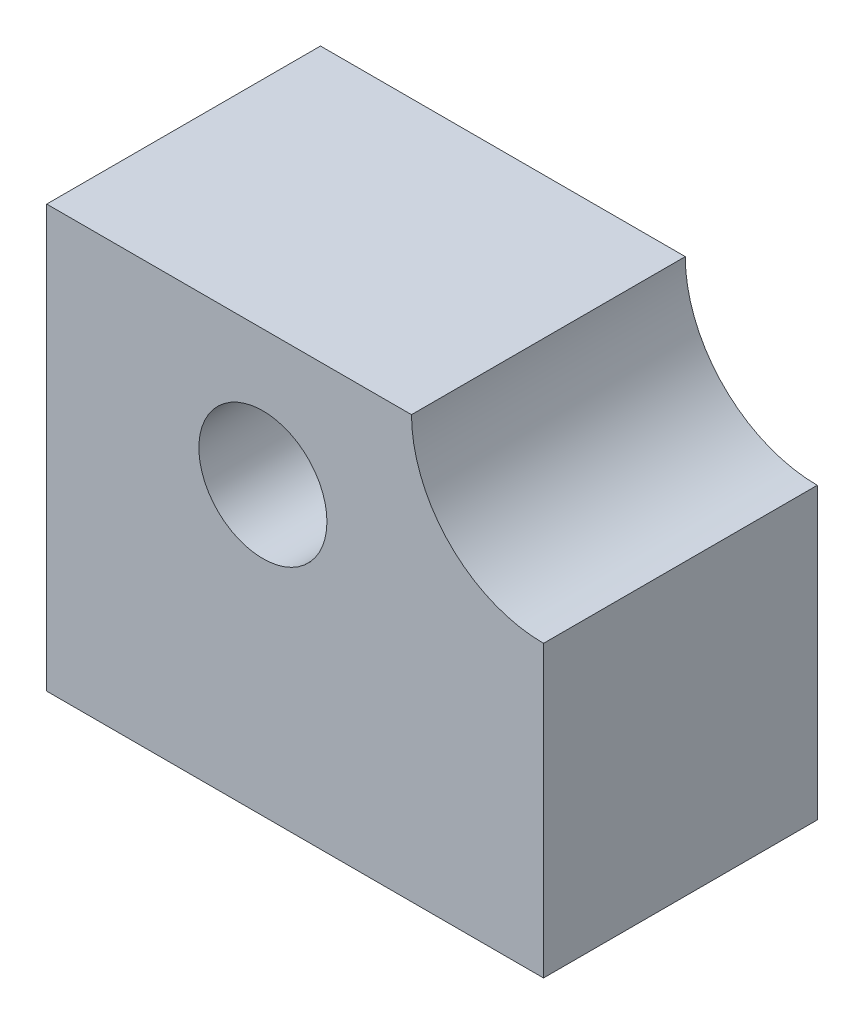
ISO-10303-21;
HEADER;
FILE_DESCRIPTION(('STEP AP214'),'2;1');
FILE_NAME('part.step','',(''),(''),'','','');
FILE_SCHEMA(('AUTOMOTIVE_DESIGN { 1 0 10303 214 1 1 1 1 }'));
ENDSEC;
DATA;
#1=APPLICATION_CONTEXT('core data for automotive mechanical design processes');
#2=APPLICATION_PROTOCOL_DEFINITION('international standard','automotive_design',2000,#1);
#3=PRODUCT_CONTEXT('',#1,'mechanical');
#4=PRODUCT('Part','Part','',(#3));
#5=PRODUCT_RELATED_PRODUCT_CATEGORY('part','',(#4));
#6=PRODUCT_DEFINITION_FORMATION('','',#4);
#7=PRODUCT_DEFINITION_CONTEXT('part definition',#1,'design');
#8=PRODUCT_DEFINITION('design','',#6,#7);
#9=PRODUCT_DEFINITION_SHAPE('','',#8);
#10=(LENGTH_UNIT() NAMED_UNIT(*) SI_UNIT(.MILLI.,.METRE.));
#11=(NAMED_UNIT(*) PLANE_ANGLE_UNIT() SI_UNIT($,.RADIAN.));
#12=(NAMED_UNIT(*) SI_UNIT($,.STERADIAN.) SOLID_ANGLE_UNIT());
#13=UNCERTAINTY_MEASURE_WITH_UNIT(LENGTH_MEASURE(1.E-05),#10,'distance_accuracy_value','');
#14=(GEOMETRIC_REPRESENTATION_CONTEXT(3) GLOBAL_UNCERTAINTY_ASSIGNED_CONTEXT((#13)) GLOBAL_UNIT_ASSIGNED_CONTEXT((#10,
#11,#12)) REPRESENTATION_CONTEXT('',''));
#15=CARTESIAN_POINT('',(0.,0.,0.));
#16=DIRECTION('',(0.,0.,1.));
#17=DIRECTION('',(1.,0.,0.));
#18=AXIS2_PLACEMENT_3D('',#15,#16,#17);
#19=CARTESIAN_POINT('',(-31.2879279174834,30.4118659357938,32.));
#20=DIRECTION('',(1.,0.,0.));
#21=DIRECTION('',(0.,0.,-1.));
#22=AXIS2_PLACEMENT_3D('',#19,#20,#21);
#23=PLANE('',#22);
#24=DIRECTION('',(0.,-1.,0.));
#25=VECTOR('',#24,1.);
#26=CARTESIAN_POINT('',(-31.2879279174834,30.4118659357938,0.));
#27=LINE('',#26,#25);
#28=CARTESIAN_POINT('',(-31.2879279174834,30.4118659357938,0.));
#29=VERTEX_POINT('',#28);
#30=CARTESIAN_POINT('',(-31.2879279174834,-18.8979084621599,0.));
#31=VERTEX_POINT('',#30);
#32=EDGE_CURVE('E110',#29,#31,#27,.T.);
#33=ORIENTED_EDGE('',*,*,#32,.T.);
#34=DIRECTION('',(0.,0.,-1.));
#35=VECTOR('',#34,1.);
#36=CARTESIAN_POINT('',(-31.2879279174834,-18.8979084621599,32.));
#37=LINE('',#36,#35);
#38=CARTESIAN_POINT('',(-31.2879279174834,-18.8979084621599,32.));
#39=VERTEX_POINT('',#38);
#40=EDGE_CURVE('E11',#39,#31,#37,.T.);
#41=ORIENTED_EDGE('',*,*,#40,.F.);
#42=DIRECTION('',(0.,-1.,0.));
#43=VECTOR('',#42,1.);
#44=CARTESIAN_POINT('',(-31.2879279174834,30.4118659357938,32.));
#45=LINE('',#44,#43);
#46=CARTESIAN_POINT('',(-31.2879279174834,30.4118659357938,32.));
#47=VERTEX_POINT('',#46);
#48=EDGE_CURVE('E112',#47,#39,#45,.T.);
#49=ORIENTED_EDGE('',*,*,#48,.F.);
#50=DIRECTION('',(0.,0.,-1.));
#51=VECTOR('',#50,1.);
#52=CARTESIAN_POINT('',(-31.2879279174834,30.4118659357938,32.));
#53=LINE('',#52,#51);
#54=EDGE_CURVE('E122',#47,#29,#53,.T.);
#55=ORIENTED_EDGE('',*,*,#54,.T.);
#56=EDGE_LOOP('',(#33,#41,#49,#55));
#57=FACE_BOUND('',#56,.T.);
#58=ADVANCED_FACE('F39',(#57),#23,.F.);
#59=CARTESIAN_POINT('',(-31.2879279174834,-18.8979084621599,32.));
#60=DIRECTION('',(0.,1.,0.));
#61=DIRECTION('',(0.,0.,1.));
#62=AXIS2_PLACEMENT_3D('',#59,#60,#61);
#63=PLANE('',#62);
#64=DIRECTION('',(1.,0.,0.));
#65=VECTOR('',#64,1.);
#66=CARTESIAN_POINT('',(-31.2879279174834,-18.8979084621599,0.));
#67=LINE('',#66,#65);
#68=CARTESIAN_POINT('',(26.7824662973657,-18.8979084621599,0.));
#69=VERTEX_POINT('',#68);
#70=EDGE_CURVE('E118',#31,#69,#67,.T.);
#71=ORIENTED_EDGE('',*,*,#70,.T.);
#72=DIRECTION('',(0.,0.,-1.));
#73=VECTOR('',#72,1.);
#74=CARTESIAN_POINT('',(26.7824662973657,-18.8979084621599,32.));
#75=LINE('',#74,#73);
#76=CARTESIAN_POINT('',(26.7824662973657,-18.8979084621599,32.));
#77=VERTEX_POINT('',#76);
#78=EDGE_CURVE('E47',#77,#69,#75,.T.);
#79=ORIENTED_EDGE('',*,*,#78,.F.);
#80=DIRECTION('',(1.,0.,0.));
#81=VECTOR('',#80,1.);
#82=CARTESIAN_POINT('',(-31.2879279174834,-18.8979084621599,32.));
#83=LINE('',#82,#81);
#84=EDGE_CURVE('E86',#39,#77,#83,.T.);
#85=ORIENTED_EDGE('',*,*,#84,.F.);
#86=ORIENTED_EDGE('',*,*,#40,.T.);
#87=EDGE_LOOP('',(#71,#79,#85,#86));
#88=FACE_BOUND('',#87,.T.);
#89=ADVANCED_FACE('F133',(#88),#63,.F.);
#90=CARTESIAN_POINT('',(26.7824662973657,30.4118659357938,32.));
#91=DIRECTION('',(-1.,0.,0.));
#92=DIRECTION('',(0.,0.,1.));
#93=AXIS2_PLACEMENT_3D('',#90,#91,#92);
#94=PLANE('',#93);
#95=DIRECTION('',(0.,1.,0.));
#96=VECTOR('',#95,1.);
#97=CARTESIAN_POINT('',(26.7824662973657,30.4118659357938,0.));
#98=LINE('',#97,#96);
#99=CARTESIAN_POINT('',(26.7824662973657,14.9801377571467,0.));
#100=VERTEX_POINT('',#99);
#101=EDGE_CURVE('E113',#69,#100,#98,.T.);
#102=ORIENTED_EDGE('',*,*,#101,.T.);
#103=DIRECTION('',(0.,0.,1.));
#104=VECTOR('',#103,1.);
#105=CARTESIAN_POINT('',(26.7824662973657,14.9801377571467,0.));
#106=LINE('',#105,#104);
#107=CARTESIAN_POINT('',(26.7824662973657,14.9801377571467,32.));
#108=VERTEX_POINT('',#107);
#109=EDGE_CURVE('E54',#100,#108,#106,.T.);
#110=ORIENTED_EDGE('',*,*,#109,.T.);
#111=DIRECTION('',(0.,1.,0.));
#112=VECTOR('',#111,1.);
#113=CARTESIAN_POINT('',(26.7824662973657,30.4118659357938,32.));
#114=LINE('',#113,#112);
#115=EDGE_CURVE('E130',#77,#108,#114,.T.);
#116=ORIENTED_EDGE('',*,*,#115,.F.);
#117=ORIENTED_EDGE('',*,*,#78,.T.);
#118=EDGE_LOOP('',(#102,#110,#116,#117));
#119=FACE_BOUND('',#118,.T.);
#120=ADVANCED_FACE('F128',(#119),#94,.F.);
#121=CARTESIAN_POINT('',(-31.2879279174834,30.4118659357938,32.));
#122=DIRECTION('',(0.,-1.,0.));
#123=DIRECTION('',(0.,0.,-1.));
#124=AXIS2_PLACEMENT_3D('',#121,#122,#123);
#125=PLANE('',#124);
#126=DIRECTION('',(-1.,0.,0.));
#127=VECTOR('',#126,1.);
#128=CARTESIAN_POINT('',(-31.2879279174834,30.4118659357938,32.));
#129=LINE('',#128,#127);
#130=CARTESIAN_POINT('',(11.3507381187187,30.4118659357938,32.));
#131=VERTEX_POINT('',#130);
#132=EDGE_CURVE('E63',#131,#47,#129,.T.);
#133=ORIENTED_EDGE('',*,*,#132,.F.);
#134=DIRECTION('',(0.,0.,1.));
#135=VECTOR('',#134,1.);
#136=CARTESIAN_POINT('',(11.3507381187187,30.4118659357938,0.));
#137=LINE('',#136,#135);
#138=CARTESIAN_POINT('',(11.3507381187187,30.4118659357938,0.));
#139=VERTEX_POINT('',#138);
#140=EDGE_CURVE('E95',#131,#139,#137,.F.);
#141=ORIENTED_EDGE('',*,*,#140,.T.);
#142=DIRECTION('',(-1.,0.,0.));
#143=VECTOR('',#142,1.);
#144=CARTESIAN_POINT('',(-31.2879279174834,30.4118659357938,0.));
#145=LINE('',#144,#143);
#146=EDGE_CURVE('E81',#139,#29,#145,.T.);
#147=ORIENTED_EDGE('',*,*,#146,.T.);
#148=ORIENTED_EDGE('',*,*,#54,.F.);
#149=EDGE_LOOP('',(#133,#141,#147,#148));
#150=FACE_BOUND('',#149,.T.);
#151=ADVANCED_FACE('F103',(#150),#125,.F.);
#152=CARTESIAN_POINT('',(0.,0.,32.));
#153=DIRECTION('',(0.,0.,1.));
#154=DIRECTION('',(1.,0.,0.));
#155=AXIS2_PLACEMENT_3D('',#152,#153,#154);
#156=PLANE('',#155);
#157=CARTESIAN_POINT('',(-6.01795013763251,14.6360017978964,32.));
#158=DIRECTION('',(0.,0.,1.));
#159=DIRECTION('',(1.,0.,0.));
#160=AXIS2_PLACEMENT_3D('',#157,#158,#159);
#161=CIRCLE('',#160,7.48400598659491);
#162=CARTESIAN_POINT('',(1.4660558489624,14.6360017978964,32.));
#163=VERTEX_POINT('',#162);
#164=EDGE_CURVE('E100',#163,#163,#161,.T.);
#165=ORIENTED_EDGE('',*,*,#164,.F.);
#166=EDGE_LOOP('',(#165));
#167=FACE_BOUND('',#166,.T.);
#168=CARTESIAN_POINT('',(26.7824662973657,30.4118659357938,32.));
#169=DIRECTION('',(0.,0.,1.));
#170=DIRECTION('',(1.,0.,0.));
#171=AXIS2_PLACEMENT_3D('',#168,#169,#170);
#172=CIRCLE('',#171,15.4317281786471);
#173=EDGE_CURVE('E101',#131,#108,#172,.T.);
#174=ORIENTED_EDGE('',*,*,#173,.F.);
#175=ORIENTED_EDGE('',*,*,#132,.T.);
#176=ORIENTED_EDGE('',*,*,#48,.T.);
#177=ORIENTED_EDGE('',*,*,#84,.T.);
#178=ORIENTED_EDGE('',*,*,#115,.T.);
#179=EDGE_LOOP('',(#174,#175,#176,#177,#178));
#180=FACE_BOUND('',#179,.T.);
#181=ADVANCED_FACE('F163',(#167,#180),#156,.T.);
#182=CARTESIAN_POINT('',(0.,0.,0.));
#183=DIRECTION('',(0.,0.,1.));
#184=DIRECTION('',(1.,0.,0.));
#185=AXIS2_PLACEMENT_3D('',#182,#183,#184);
#186=PLANE('',#185);
#187=CARTESIAN_POINT('',(-6.01795013763251,14.6360017978964,0.));
#188=DIRECTION('',(0.,0.,1.));
#189=DIRECTION('',(1.,0.,0.));
#190=AXIS2_PLACEMENT_3D('',#187,#188,#189);
#191=CIRCLE('',#190,7.48400598659491);
#192=CARTESIAN_POINT('',(1.4660558489624,14.6360017978964,0.));
#193=VERTEX_POINT('',#192);
#194=EDGE_CURVE('E105',#193,#193,#191,.T.);
#195=ORIENTED_EDGE('',*,*,#194,.T.);
#196=EDGE_LOOP('',(#195));
#197=FACE_BOUND('',#196,.T.);
#198=ORIENTED_EDGE('',*,*,#146,.F.);
#199=CARTESIAN_POINT('',(26.7824662973657,30.4118659357938,0.));
#200=DIRECTION('',(0.,0.,1.));
#201=DIRECTION('',(1.,0.,0.));
#202=AXIS2_PLACEMENT_3D('',#199,#200,#201);
#203=CIRCLE('',#202,15.4317281786471);
#204=EDGE_CURVE('E93',#139,#100,#203,.T.);
#205=ORIENTED_EDGE('',*,*,#204,.T.);
#206=ORIENTED_EDGE('',*,*,#101,.F.);
#207=ORIENTED_EDGE('',*,*,#70,.F.);
#208=ORIENTED_EDGE('',*,*,#32,.F.);
#209=EDGE_LOOP('',(#198,#205,#206,#207,#208));
#210=FACE_BOUND('',#209,.T.);
#211=ADVANCED_FACE('F108',(#197,#210),#186,.F.);
#212=CARTESIAN_POINT('',(26.7824662973657,30.4118659357938,0.));
#213=DIRECTION('',(0.,0.,1.));
#214=DIRECTION('',(1.,0.,0.));
#215=AXIS2_PLACEMENT_3D('',#212,#213,#214);
#216=CYLINDRICAL_SURFACE('',#215,15.4317281786471);
#217=ORIENTED_EDGE('',*,*,#204,.F.);
#218=ORIENTED_EDGE('',*,*,#140,.F.);
#219=ORIENTED_EDGE('',*,*,#173,.T.);
#220=ORIENTED_EDGE('',*,*,#109,.F.);
#221=EDGE_LOOP('',(#217,#218,#219,#220));
#222=FACE_BOUND('',#221,.T.);
#223=ADVANCED_FACE('F94',(#222),#216,.F.);
#224=CARTESIAN_POINT('',(-6.01795013763251,14.6360017978964,0.));
#225=DIRECTION('',(0.,0.,1.));
#226=DIRECTION('',(1.,0.,0.));
#227=AXIS2_PLACEMENT_3D('',#224,#225,#226);
#228=CYLINDRICAL_SURFACE('',#227,7.48400598659491);
#229=ORIENTED_EDGE('',*,*,#194,.F.);
#230=EDGE_LOOP('',(#229));
#231=FACE_BOUND('',#230,.T.);
#232=ORIENTED_EDGE('',*,*,#164,.T.);
#233=EDGE_LOOP('',(#232));
#234=FACE_BOUND('',#233,.T.);
#235=ADVANCED_FACE('F157',(#231,#234),#228,.F.);
#236=CLOSED_SHELL('',(#58,#89,#120,#151,#181,#211,#223,#235));
#237=MANIFOLD_SOLID_BREP('B2',#236);
#238=ADVANCED_BREP_SHAPE_REPRESENTATION('',(#18,#237),#14);
#239=SHAPE_DEFINITION_REPRESENTATION(#9,#238);
ENDSEC;
END-ISO-10303-21;
